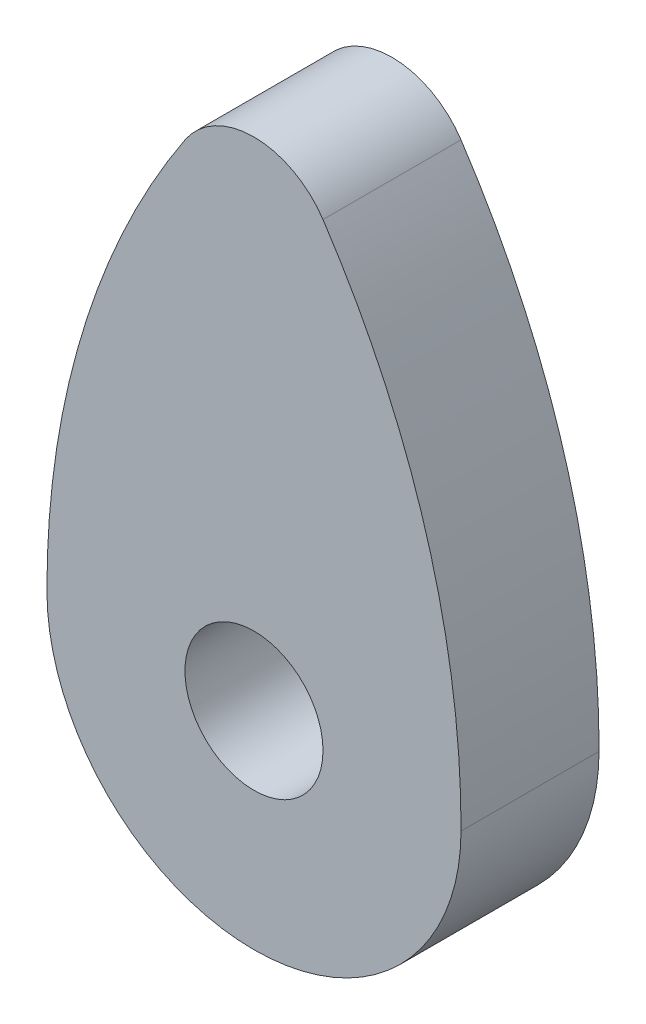
ISO-10303-21;
HEADER;
FILE_DESCRIPTION(('STEP AP214'),'2;1');
FILE_NAME('part.step','',(''),(''),'','','');
FILE_SCHEMA(('AUTOMOTIVE_DESIGN { 1 0 10303 214 1 1 1 1 }'));
ENDSEC;
DATA;
#1=APPLICATION_CONTEXT('core data for automotive mechanical design processes');
#2=APPLICATION_PROTOCOL_DEFINITION('international standard','automotive_design',2000,#1);
#3=PRODUCT_CONTEXT('',#1,'mechanical');
#4=PRODUCT('Part','Part','',(#3));
#5=PRODUCT_RELATED_PRODUCT_CATEGORY('part','',(#4));
#6=PRODUCT_DEFINITION_FORMATION('','',#4);
#7=PRODUCT_DEFINITION_CONTEXT('part definition',#1,'design');
#8=PRODUCT_DEFINITION('design','',#6,#7);
#9=PRODUCT_DEFINITION_SHAPE('','',#8);
#10=(LENGTH_UNIT() NAMED_UNIT(*) SI_UNIT(.MILLI.,.METRE.));
#11=(NAMED_UNIT(*) PLANE_ANGLE_UNIT() SI_UNIT($,.RADIAN.));
#12=(NAMED_UNIT(*) SI_UNIT($,.STERADIAN.) SOLID_ANGLE_UNIT());
#13=UNCERTAINTY_MEASURE_WITH_UNIT(LENGTH_MEASURE(1.E-05),#10,'distance_accuracy_value','');
#14=(GEOMETRIC_REPRESENTATION_CONTEXT(3) GLOBAL_UNCERTAINTY_ASSIGNED_CONTEXT((#13)) GLOBAL_UNIT_ASSIGNED_CONTEXT((#10,
#11,#12)) REPRESENTATION_CONTEXT('',''));
#15=CARTESIAN_POINT('',(0.,0.,0.));
#16=DIRECTION('',(0.,0.,1.));
#17=DIRECTION('',(1.,0.,0.));
#18=AXIS2_PLACEMENT_3D('',#15,#16,#17);
#19=CARTESIAN_POINT('',(22.4998749996528,0.0750000000000009,5.));
#20=DIRECTION('',(0.,0.,1.));
#21=DIRECTION('',(1.,0.,0.));
#22=AXIS2_PLACEMENT_3D('',#19,#20,#21);
#23=PLANE('',#22);
#24=CARTESIAN_POINT('',(44.9997499993056,0.150000000000002,5.));
#25=DIRECTION('',(0.,0.,1.));
#26=DIRECTION('',(1.,0.,0.));
#27=AXIS2_PLACEMENT_3D('',#24,#25,#26);
#28=CIRCLE('',#27,60.);
#29=CARTESIAN_POINT('',(-4.99997222214506,33.3166666666667,5.));
#30=VERTEX_POINT('',#29);
#31=CARTESIAN_POINT('',(-14.9999166664352,-0.049999999999997,5.));
#32=VERTEX_POINT('',#31);
#33=EDGE_CURVE('E92',#30,#32,#28,.T.);
#34=ORIENTED_EDGE('',*,*,#33,.T.);
#35=CARTESIAN_POINT('',(0.,0.,5.));
#36=DIRECTION('',(0.,0.,1.));
#37=DIRECTION('',(1.,0.,0.));
#38=AXIS2_PLACEMENT_3D('',#35,#36,#37);
#39=CIRCLE('',#38,15.);
#40=CARTESIAN_POINT('',(14.9999166664352,-0.0499999999999861,5.));
#41=VERTEX_POINT('',#40);
#42=EDGE_CURVE('E87',#32,#41,#39,.T.);
#43=ORIENTED_EDGE('',*,*,#42,.T.);
#44=CARTESIAN_POINT('',(-44.9997499993056,0.150000000000002,5.));
#45=DIRECTION('',(0.,0.,1.));
#46=DIRECTION('',(-1.,0.,0.));
#47=AXIS2_PLACEMENT_3D('',#44,#45,#46);
#48=CIRCLE('',#47,60.);
#49=CARTESIAN_POINT('',(4.99997222214506,33.3166666666667,5.));
#50=VERTEX_POINT('',#49);
#51=EDGE_CURVE('E90',#41,#50,#48,.T.);
#52=ORIENTED_EDGE('',*,*,#51,.T.);
#53=CARTESIAN_POINT('',(0.,30.,5.));
#54=DIRECTION('',(0.,0.,1.));
#55=DIRECTION('',(1.,0.,0.));
#56=AXIS2_PLACEMENT_3D('',#53,#54,#55);
#57=CIRCLE('',#56,6.);
#58=EDGE_CURVE('E57',#50,#30,#57,.T.);
#59=ORIENTED_EDGE('',*,*,#58,.T.);
#60=EDGE_LOOP('',(#34,#43,#52,#59));
#61=FACE_BOUND('',#60,.T.);
#62=CARTESIAN_POINT('',(0.,0.,5.));
#63=DIRECTION('',(0.,0.,1.));
#64=DIRECTION('',(1.,0.,0.));
#65=AXIS2_PLACEMENT_3D('',#62,#63,#64);
#66=CIRCLE('',#65,5.);
#67=CARTESIAN_POINT('',(5.,0.,5.));
#68=VERTEX_POINT('',#67);
#69=EDGE_CURVE('E112',#68,#68,#66,.T.);
#70=ORIENTED_EDGE('',*,*,#69,.F.);
#71=EDGE_LOOP('',(#70));
#72=FACE_BOUND('',#71,.T.);
#73=ADVANCED_FACE('F39',(#61,#72),#23,.T.);
#74=CARTESIAN_POINT('',(22.4998749996528,0.0750000000000009,-5.));
#75=DIRECTION('',(0.,0.,1.));
#76=DIRECTION('',(1.,0.,0.));
#77=AXIS2_PLACEMENT_3D('',#74,#75,#76);
#78=PLANE('',#77);
#79=CARTESIAN_POINT('',(44.9997499993056,0.150000000000002,-5.));
#80=DIRECTION('',(0.,0.,1.));
#81=DIRECTION('',(1.,0.,0.));
#82=AXIS2_PLACEMENT_3D('',#79,#80,#81);
#83=CIRCLE('',#82,60.);
#84=CARTESIAN_POINT('',(-4.99997222214506,33.3166666666667,-5.));
#85=VERTEX_POINT('',#84);
#86=CARTESIAN_POINT('',(-14.9999166664352,-0.049999999999997,-5.));
#87=VERTEX_POINT('',#86);
#88=EDGE_CURVE('E108',#85,#87,#83,.T.);
#89=ORIENTED_EDGE('',*,*,#88,.F.);
#90=CARTESIAN_POINT('',(0.,30.,-5.));
#91=DIRECTION('',(0.,0.,1.));
#92=DIRECTION('',(1.,0.,0.));
#93=AXIS2_PLACEMENT_3D('',#90,#91,#92);
#94=CIRCLE('',#93,6.);
#95=CARTESIAN_POINT('',(4.99997222214506,33.3166666666667,-5.));
#96=VERTEX_POINT('',#95);
#97=EDGE_CURVE('E80',#96,#85,#94,.T.);
#98=ORIENTED_EDGE('',*,*,#97,.F.);
#99=CARTESIAN_POINT('',(-44.9997499993056,0.150000000000002,-5.));
#100=DIRECTION('',(0.,0.,1.));
#101=DIRECTION('',(-1.,0.,0.));
#102=AXIS2_PLACEMENT_3D('',#99,#100,#101);
#103=CIRCLE('',#102,60.);
#104=CARTESIAN_POINT('',(14.9999166664352,-0.0499999999999861,-5.));
#105=VERTEX_POINT('',#104);
#106=EDGE_CURVE('E74',#105,#96,#103,.T.);
#107=ORIENTED_EDGE('',*,*,#106,.F.);
#108=CARTESIAN_POINT('',(0.,0.,-5.));
#109=DIRECTION('',(0.,0.,1.));
#110=DIRECTION('',(1.,0.,0.));
#111=AXIS2_PLACEMENT_3D('',#108,#109,#110);
#112=CIRCLE('',#111,15.);
#113=EDGE_CURVE('E97',#87,#105,#112,.T.);
#114=ORIENTED_EDGE('',*,*,#113,.F.);
#115=EDGE_LOOP('',(#89,#98,#107,#114));
#116=FACE_BOUND('',#115,.T.);
#117=CARTESIAN_POINT('',(0.,0.,-5.));
#118=DIRECTION('',(0.,0.,1.));
#119=DIRECTION('',(1.,0.,0.));
#120=AXIS2_PLACEMENT_3D('',#117,#118,#119);
#121=CIRCLE('',#120,5.);
#122=CARTESIAN_POINT('',(5.,0.,-5.));
#123=VERTEX_POINT('',#122);
#124=EDGE_CURVE('E130',#123,#123,#121,.T.);
#125=ORIENTED_EDGE('',*,*,#124,.T.);
#126=EDGE_LOOP('',(#125));
#127=FACE_BOUND('',#126,.T.);
#128=ADVANCED_FACE('F125',(#116,#127),#78,.F.);
#129=CARTESIAN_POINT('',(44.9997499993056,0.150000000000002,5.));
#130=DIRECTION('',(0.,0.,-1.));
#131=DIRECTION('',(-1.,0.,0.));
#132=AXIS2_PLACEMENT_3D('',#129,#130,#131);
#133=CYLINDRICAL_SURFACE('',#132,60.);
#134=ORIENTED_EDGE('',*,*,#88,.T.);
#135=DIRECTION('',(0.,0.,-1.));
#136=VECTOR('',#135,1.);
#137=CARTESIAN_POINT('',(-14.9999166664352,-0.049999999999997,5.));
#138=LINE('',#137,#136);
#139=EDGE_CURVE('E11',#32,#87,#138,.T.);
#140=ORIENTED_EDGE('',*,*,#139,.F.);
#141=ORIENTED_EDGE('',*,*,#33,.F.);
#142=DIRECTION('',(0.,0.,-1.));
#143=VECTOR('',#142,1.);
#144=CARTESIAN_POINT('',(-4.99997222214506,33.3166666666667,5.));
#145=LINE('',#144,#143);
#146=EDGE_CURVE('E104',#30,#85,#145,.T.);
#147=ORIENTED_EDGE('',*,*,#146,.T.);
#148=EDGE_LOOP('',(#134,#140,#141,#147));
#149=FACE_BOUND('',#148,.T.);
#150=ADVANCED_FACE('F41',(#149),#133,.T.);
#151=CARTESIAN_POINT('',(0.,0.,5.));
#152=DIRECTION('',(0.,0.,-1.));
#153=DIRECTION('',(-1.,0.,0.));
#154=AXIS2_PLACEMENT_3D('',#151,#152,#153);
#155=CYLINDRICAL_SURFACE('',#154,15.);
#156=ORIENTED_EDGE('',*,*,#113,.T.);
#157=DIRECTION('',(0.,0.,-1.));
#158=VECTOR('',#157,1.);
#159=CARTESIAN_POINT('',(14.9999166664352,-0.0499999999999861,5.));
#160=LINE('',#159,#158);
#161=EDGE_CURVE('E49',#41,#105,#160,.T.);
#162=ORIENTED_EDGE('',*,*,#161,.F.);
#163=ORIENTED_EDGE('',*,*,#42,.F.);
#164=ORIENTED_EDGE('',*,*,#139,.T.);
#165=EDGE_LOOP('',(#156,#162,#163,#164));
#166=FACE_BOUND('',#165,.T.);
#167=ADVANCED_FACE('F96',(#166),#155,.T.);
#168=CARTESIAN_POINT('',(-44.9997499993056,0.150000000000002,5.));
#169=DIRECTION('',(0.,0.,-1.));
#170=DIRECTION('',(-1.,0.,0.));
#171=AXIS2_PLACEMENT_3D('',#168,#169,#170);
#172=CYLINDRICAL_SURFACE('',#171,60.);
#173=ORIENTED_EDGE('',*,*,#106,.T.);
#174=DIRECTION('',(0.,0.,-1.));
#175=VECTOR('',#174,1.);
#176=CARTESIAN_POINT('',(4.99997222214506,33.3166666666667,5.));
#177=LINE('',#176,#175);
#178=EDGE_CURVE('E99',#50,#96,#177,.T.);
#179=ORIENTED_EDGE('',*,*,#178,.F.);
#180=ORIENTED_EDGE('',*,*,#51,.F.);
#181=ORIENTED_EDGE('',*,*,#161,.T.);
#182=EDGE_LOOP('',(#173,#179,#180,#181));
#183=FACE_BOUND('',#182,.T.);
#184=ADVANCED_FACE('F100',(#183),#172,.T.);
#185=CARTESIAN_POINT('',(0.,30.,5.));
#186=DIRECTION('',(0.,0.,-1.));
#187=DIRECTION('',(-1.,0.,0.));
#188=AXIS2_PLACEMENT_3D('',#185,#186,#187);
#189=CYLINDRICAL_SURFACE('',#188,6.);
#190=ORIENTED_EDGE('',*,*,#97,.T.);
#191=ORIENTED_EDGE('',*,*,#146,.F.);
#192=ORIENTED_EDGE('',*,*,#58,.F.);
#193=ORIENTED_EDGE('',*,*,#178,.T.);
#194=EDGE_LOOP('',(#190,#191,#192,#193));
#195=FACE_BOUND('',#194,.T.);
#196=ADVANCED_FACE('F122',(#195),#189,.T.);
#197=CARTESIAN_POINT('',(0.,0.,5.));
#198=DIRECTION('',(0.,0.,-1.));
#199=DIRECTION('',(-1.,0.,0.));
#200=AXIS2_PLACEMENT_3D('',#197,#198,#199);
#201=CYLINDRICAL_SURFACE('',#200,5.);
#202=ORIENTED_EDGE('',*,*,#69,.T.);
#203=EDGE_LOOP('',(#202));
#204=FACE_BOUND('',#203,.T.);
#205=ORIENTED_EDGE('',*,*,#124,.F.);
#206=EDGE_LOOP('',(#205));
#207=FACE_BOUND('',#206,.T.);
#208=ADVANCED_FACE('F138',(#204,#207),#201,.F.);
#209=CLOSED_SHELL('',(#73,#128,#150,#167,#184,#196,#208));
#210=MANIFOLD_SOLID_BREP('B2',#209);
#211=ADVANCED_BREP_SHAPE_REPRESENTATION('',(#18,#210),#14);
#212=SHAPE_DEFINITION_REPRESENTATION(#9,#211);
ENDSEC;
END-ISO-10303-21;
